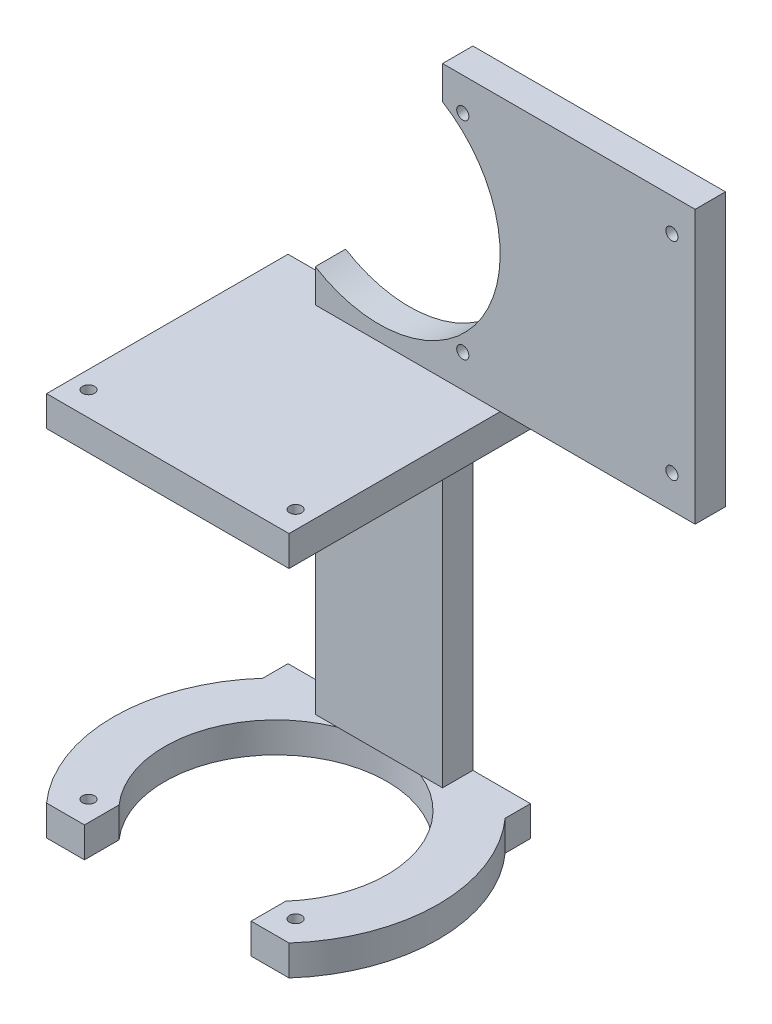
ISO-10303-21;
HEADER;
FILE_DESCRIPTION(('STEP AP214'),'2;1');
FILE_NAME('part.step','',(''),(''),'','','');
FILE_SCHEMA(('AUTOMOTIVE_DESIGN { 1 0 10303 214 1 1 1 1 }'));
ENDSEC;
DATA;
#1=APPLICATION_CONTEXT('core data for automotive mechanical design processes');
#2=APPLICATION_PROTOCOL_DEFINITION('international standard','automotive_design',2000,#1);
#3=PRODUCT_CONTEXT('',#1,'mechanical');
#4=PRODUCT('Part','Part','',(#3));
#5=PRODUCT_RELATED_PRODUCT_CATEGORY('part','',(#4));
#6=PRODUCT_DEFINITION_FORMATION('','',#4);
#7=PRODUCT_DEFINITION_CONTEXT('part definition',#1,'design');
#8=PRODUCT_DEFINITION('design','',#6,#7);
#9=PRODUCT_DEFINITION_SHAPE('','',#8);
#10=(LENGTH_UNIT() NAMED_UNIT(*) SI_UNIT(.MILLI.,.METRE.));
#11=(NAMED_UNIT(*) PLANE_ANGLE_UNIT() SI_UNIT($,.RADIAN.));
#12=(NAMED_UNIT(*) SI_UNIT($,.STERADIAN.) SOLID_ANGLE_UNIT());
#13=UNCERTAINTY_MEASURE_WITH_UNIT(LENGTH_MEASURE(1.E-05),#10,'distance_accuracy_value','');
#14=(GEOMETRIC_REPRESENTATION_CONTEXT(3) GLOBAL_UNCERTAINTY_ASSIGNED_CONTEXT((#13)) GLOBAL_UNIT_ASSIGNED_CONTEXT((#10,
#11,#12)) REPRESENTATION_CONTEXT('',''));
#15=CARTESIAN_POINT('',(0.,0.,0.));
#16=DIRECTION('',(0.,0.,1.));
#17=DIRECTION('',(1.,0.,0.));
#18=AXIS2_PLACEMENT_3D('',#15,#16,#17);
#19=CARTESIAN_POINT('',(0.,-38.1,0.));
#20=DIRECTION('',(0.,-1.,0.));
#21=DIRECTION('',(0.,0.,-1.));
#22=AXIS2_PLACEMENT_3D('',#19,#20,#21);
#23=PLANE('',#22);
#24=CARTESIAN_POINT('',(3.95000000000001,-38.1,21.5));
#25=DIRECTION('',(0.,-1.,0.));
#26=DIRECTION('',(0.,0.,-1.));
#27=AXIS2_PLACEMENT_3D('',#24,#25,#26);
#28=CIRCLE('',#27,0.6);
#29=CARTESIAN_POINT('',(3.95000000000001,-38.1,20.9));
#30=VERTEX_POINT('',#29);
#31=EDGE_CURVE('E228',#30,#30,#28,.T.);
#32=ORIENTED_EDGE('',*,*,#31,.F.);
#33=EDGE_LOOP('',(#32));
#34=FACE_BOUND('',#33,.T.);
#35=CARTESIAN_POINT('',(-16.55,-38.1,21.5));
#36=DIRECTION('',(0.,-1.,0.));
#37=DIRECTION('',(0.,0.,-1.));
#38=AXIS2_PLACEMENT_3D('',#35,#36,#37);
#39=CIRCLE('',#38,0.6);
#40=CARTESIAN_POINT('',(-16.55,-38.1,20.9));
#41=VERTEX_POINT('',#40);
#42=EDGE_CURVE('E276',#41,#41,#39,.T.);
#43=ORIENTED_EDGE('',*,*,#42,.F.);
#44=EDGE_LOOP('',(#43));
#45=FACE_BOUND('',#44,.T.);
#46=DIRECTION('',(1.,0.,0.));
#47=VECTOR('',#46,1.);
#48=CARTESIAN_POINT('',(-18.3,-38.1,23.9));
#49=LINE('',#48,#47);
#50=CARTESIAN_POINT('',(1.95,-38.1,23.9));
#51=VERTEX_POINT('',#50);
#52=CARTESIAN_POINT('',(5.70000000000001,-38.1,23.9));
#53=VERTEX_POINT('',#52);
#54=EDGE_CURVE('E213',#51,#53,#49,.T.);
#55=ORIENTED_EDGE('',*,*,#54,.F.);
#56=DIRECTION('',(0.,0.,-1.));
#57=VECTOR('',#56,1.);
#58=CARTESIAN_POINT('',(1.94999999999999,-38.1,0.));
#59=LINE('',#58,#57);
#60=CARTESIAN_POINT('',(1.95,-38.1,20.4758161054276));
#61=VERTEX_POINT('',#60);
#62=EDGE_CURVE('E256',#51,#61,#59,.T.);
#63=ORIENTED_EDGE('',*,*,#62,.T.);
#64=CARTESIAN_POINT('',(-6.29999999999999,-38.1,13.2));
#65=DIRECTION('',(0.,-1.,0.));
#66=DIRECTION('',(0.,0.,-1.));
#67=AXIS2_PLACEMENT_3D('',#64,#65,#66);
#68=CIRCLE('',#67,11.);
#69=CARTESIAN_POINT('',(-14.55,-38.1,20.4758161054276));
#70=VERTEX_POINT('',#69);
#71=EDGE_CURVE('E245',#70,#61,#68,.T.);
#72=ORIENTED_EDGE('',*,*,#71,.F.);
#73=DIRECTION('',(0.,0.,-1.));
#74=VECTOR('',#73,1.);
#75=CARTESIAN_POINT('',(-14.55,-38.1,0.));
#76=LINE('',#75,#74);
#77=CARTESIAN_POINT('',(-14.55,-38.1,23.9));
#78=VERTEX_POINT('',#77);
#79=EDGE_CURVE('E259',#78,#70,#76,.T.);
#80=ORIENTED_EDGE('',*,*,#79,.F.);
#81=CARTESIAN_POINT('',(-18.3,-38.1,23.9));
#82=VERTEX_POINT('',#81);
#83=EDGE_CURVE('E219',#82,#78,#49,.T.);
#84=ORIENTED_EDGE('',*,*,#83,.F.);
#85=CARTESIAN_POINT('',(-6.29999999999999,-38.1,13.2));
#86=DIRECTION('',(0.,-1.,0.));
#87=DIRECTION('',(0.,0.,-1.));
#88=AXIS2_PLACEMENT_3D('',#85,#86,#87);
#89=CIRCLE('',#88,16.0776242025991);
#90=CARTESIAN_POINT('',(-18.3,-38.1,2.5));
#91=VERTEX_POINT('',#90);
#92=EDGE_CURVE('E231',#82,#91,#89,.T.);
#93=ORIENTED_EDGE('',*,*,#92,.T.);
#94=DIRECTION('',(0.,0.,1.));
#95=VECTOR('',#94,1.);
#96=CARTESIAN_POINT('',(-18.3,-38.1,-24.1867732448957));
#97=LINE('',#96,#95);
#98=CARTESIAN_POINT('',(-18.3,-38.1,0.));
#99=VERTEX_POINT('',#98);
#100=EDGE_CURVE('E299',#99,#91,#97,.T.);
#101=ORIENTED_EDGE('',*,*,#100,.F.);
#102=DIRECTION('',(1.,0.,0.));
#103=VECTOR('',#102,1.);
#104=CARTESIAN_POINT('',(0.,-38.1,0.));
#105=LINE('',#104,#103);
#106=CARTESIAN_POINT('',(5.70000000000001,-38.1,0.));
#107=VERTEX_POINT('',#106);
#108=EDGE_CURVE('E361',#99,#107,#105,.T.);
#109=ORIENTED_EDGE('',*,*,#108,.T.);
#110=DIRECTION('',(0.,0.,1.));
#111=VECTOR('',#110,1.);
#112=CARTESIAN_POINT('',(5.70000000000001,-38.1,-24.1867732448957));
#113=LINE('',#112,#111);
#114=CARTESIAN_POINT('',(5.70000000000001,-38.1,2.5));
#115=VERTEX_POINT('',#114);
#116=EDGE_CURVE('E301',#107,#115,#113,.T.);
#117=ORIENTED_EDGE('',*,*,#116,.T.);
#118=CARTESIAN_POINT('',(-6.29999999999999,-38.1,13.2));
#119=DIRECTION('',(0.,-1.,0.));
#120=DIRECTION('',(0.,0.,-1.));
#121=AXIS2_PLACEMENT_3D('',#118,#119,#120);
#122=CIRCLE('',#121,16.0776242025991);
#123=EDGE_CURVE('E236',#115,#53,#122,.T.);
#124=ORIENTED_EDGE('',*,*,#123,.T.);
#125=EDGE_LOOP('',(#55,#63,#72,#80,#84,#93,#101,#109,#117,#124));
#126=FACE_BOUND('',#125,.T.);
#127=ADVANCED_FACE('F36',(#34,#45,#126),#23,.T.);
#128=CARTESIAN_POINT('',(-18.3,-35.1,-24.1867732448957));
#129=DIRECTION('',(0.,-1.,0.));
#130=DIRECTION('',(0.,0.,-1.));
#131=AXIS2_PLACEMENT_3D('',#128,#129,#130);
#132=PLANE('',#131);
#133=CARTESIAN_POINT('',(3.95000000000001,-35.1,21.5));
#134=DIRECTION('',(0.,-1.,0.));
#135=DIRECTION('',(0.,0.,-1.));
#136=AXIS2_PLACEMENT_3D('',#133,#134,#135);
#137=CIRCLE('',#136,0.6);
#138=CARTESIAN_POINT('',(3.95000000000001,-35.1,20.9));
#139=VERTEX_POINT('',#138);
#140=EDGE_CURVE('E273',#139,#139,#137,.T.);
#141=ORIENTED_EDGE('',*,*,#140,.T.);
#142=EDGE_LOOP('',(#141));
#143=FACE_BOUND('',#142,.T.);
#144=DIRECTION('',(0.,0.,1.));
#145=VECTOR('',#144,1.);
#146=CARTESIAN_POINT('',(1.94999999999999,-35.1,0.));
#147=LINE('',#146,#145);
#148=CARTESIAN_POINT('',(1.95,-35.1,20.4758161054276));
#149=VERTEX_POINT('',#148);
#150=CARTESIAN_POINT('',(1.95,-35.1,23.9));
#151=VERTEX_POINT('',#150);
#152=EDGE_CURVE('E226',#149,#151,#147,.T.);
#153=ORIENTED_EDGE('',*,*,#152,.T.);
#154=DIRECTION('',(1.,0.,0.));
#155=VECTOR('',#154,1.);
#156=CARTESIAN_POINT('',(-18.3,-35.1,23.9));
#157=LINE('',#156,#155);
#158=CARTESIAN_POINT('',(5.70000000000001,-35.1,23.9));
#159=VERTEX_POINT('',#158);
#160=EDGE_CURVE('E211',#151,#159,#157,.T.);
#161=ORIENTED_EDGE('',*,*,#160,.T.);
#162=CARTESIAN_POINT('',(-6.29999999999999,-35.1,13.2));
#163=DIRECTION('',(0.,-1.,0.));
#164=DIRECTION('',(0.,0.,-1.));
#165=AXIS2_PLACEMENT_3D('',#162,#163,#164);
#166=CIRCLE('',#165,16.0776242025991);
#167=CARTESIAN_POINT('',(5.70000000000001,-35.1,2.5));
#168=VERTEX_POINT('',#167);
#169=EDGE_CURVE('E224',#159,#168,#166,.F.);
#170=ORIENTED_EDGE('',*,*,#169,.T.);
#171=DIRECTION('',(0.,0.,1.));
#172=VECTOR('',#171,1.);
#173=CARTESIAN_POINT('',(5.70000000000001,-35.1,-24.1867732448957));
#174=LINE('',#173,#172);
#175=CARTESIAN_POINT('',(5.70000000000001,-35.1,0.));
#176=VERTEX_POINT('',#175);
#177=EDGE_CURVE('E51',#176,#168,#174,.T.);
#178=ORIENTED_EDGE('',*,*,#177,.F.);
#179=DIRECTION('',(1.,0.,0.));
#180=VECTOR('',#179,1.);
#181=CARTESIAN_POINT('',(-18.3,-35.1,0.));
#182=LINE('',#181,#180);
#183=CARTESIAN_POINT('',(0.,-35.1,0.));
#184=VERTEX_POINT('',#183);
#185=EDGE_CURVE('E295',#184,#176,#182,.T.);
#186=ORIENTED_EDGE('',*,*,#185,.F.);
#187=DIRECTION('',(0.,0.,1.));
#188=VECTOR('',#187,1.);
#189=CARTESIAN_POINT('',(0.,-35.1,0.));
#190=LINE('',#189,#188);
#191=CARTESIAN_POINT('',(0.,-35.1,3.));
#192=VERTEX_POINT('',#191);
#193=EDGE_CURVE('E309',#184,#192,#190,.T.);
#194=ORIENTED_EDGE('',*,*,#193,.T.);
#195=DIRECTION('',(-1.,0.,0.));
#196=VECTOR('',#195,1.);
#197=CARTESIAN_POINT('',(0.,-35.1,3.));
#198=LINE('',#197,#196);
#199=CARTESIAN_POINT('',(-2.18174794360519,-35.1,3.));
#200=VERTEX_POINT('',#199);
#201=EDGE_CURVE('E306',#192,#200,#198,.T.);
#202=ORIENTED_EDGE('',*,*,#201,.T.);
#203=CARTESIAN_POINT('',(-6.29999999999999,-35.1,13.2));
#204=DIRECTION('',(0.,-1.,0.));
#205=DIRECTION('',(0.,0.,-1.));
#206=AXIS2_PLACEMENT_3D('',#203,#204,#205);
#207=CIRCLE('',#206,11.);
#208=EDGE_CURVE('E249',#149,#200,#207,.F.);
#209=ORIENTED_EDGE('',*,*,#208,.F.);
#210=EDGE_LOOP('',(#153,#161,#170,#178,#186,#194,#202,#209));
#211=FACE_BOUND('',#210,.T.);
#212=ADVANCED_FACE('F223',(#143,#211),#132,.F.);
#213=CARTESIAN_POINT('',(0.,-38.1,23.9));
#214=DIRECTION('',(0.,0.,-1.));
#215=DIRECTION('',(-1.,0.,0.));
#216=AXIS2_PLACEMENT_3D('',#213,#214,#215);
#217=PLANE('',#216);
#218=DIRECTION('',(0.,-1.,0.));
#219=VECTOR('',#218,1.);
#220=CARTESIAN_POINT('',(1.95,-4.1987055287323,23.9));
#221=LINE('',#220,#219);
#222=EDGE_CURVE('E267',#151,#51,#221,.T.);
#223=ORIENTED_EDGE('',*,*,#222,.T.);
#224=ORIENTED_EDGE('',*,*,#54,.T.);
#225=DIRECTION('',(0.,1.,0.));
#226=VECTOR('',#225,1.);
#227=CARTESIAN_POINT('',(5.70000000000001,-38.1,23.9));
#228=LINE('',#227,#226);
#229=EDGE_CURVE('E207',#53,#159,#228,.T.);
#230=ORIENTED_EDGE('',*,*,#229,.T.);
#231=ORIENTED_EDGE('',*,*,#160,.F.);
#232=EDGE_LOOP('',(#223,#224,#230,#231));
#233=FACE_BOUND('',#232,.T.);
#234=ADVANCED_FACE('F210',(#233),#217,.F.);
#235=CARTESIAN_POINT('',(0.,0.,3.));
#236=DIRECTION('',(0.,0.,-1.));
#237=DIRECTION('',(-1.,0.,0.));
#238=AXIS2_PLACEMENT_3D('',#235,#236,#237);
#239=PLANE('',#238);
#240=ORIENTED_EDGE('',*,*,#201,.F.);
#241=DIRECTION('',(0.,-1.,0.));
#242=VECTOR('',#241,1.);
#243=CARTESIAN_POINT('',(0.,0.,3.));
#244=LINE('',#243,#242);
#245=CARTESIAN_POINT('',(0.,-3.,3.));
#246=VERTEX_POINT('',#245);
#247=EDGE_CURVE('E371',#246,#192,#244,.T.);
#248=ORIENTED_EDGE('',*,*,#247,.F.);
#249=DIRECTION('',(-1.,0.,0.));
#250=VECTOR('',#249,1.);
#251=CARTESIAN_POINT('',(0.,-3.,3.));
#252=LINE('',#251,#250);
#253=CARTESIAN_POINT('',(-12.6,-3.,3.));
#254=VERTEX_POINT('',#253);
#255=EDGE_CURVE('E347',#246,#254,#252,.T.);
#256=ORIENTED_EDGE('',*,*,#255,.T.);
#257=DIRECTION('',(0.,-1.,0.));
#258=VECTOR('',#257,1.);
#259=CARTESIAN_POINT('',(-12.6,0.,3.));
#260=LINE('',#259,#258);
#261=CARTESIAN_POINT('',(-12.6,-35.1,3.));
#262=VERTEX_POINT('',#261);
#263=EDGE_CURVE('E358',#254,#262,#260,.T.);
#264=ORIENTED_EDGE('',*,*,#263,.T.);
#265=CARTESIAN_POINT('',(-10.4182520563948,-35.1,3.));
#266=VERTEX_POINT('',#265);
#267=EDGE_CURVE('E294',#266,#262,#198,.T.);
#268=ORIENTED_EDGE('',*,*,#267,.F.);
#269=DIRECTION('',(-1.,0.,0.));
#270=VECTOR('',#269,1.);
#271=CARTESIAN_POINT('',(0.,-35.1,3.));
#272=LINE('',#271,#270);
#273=EDGE_CURVE('E252',#200,#266,#272,.T.);
#274=ORIENTED_EDGE('',*,*,#273,.F.);
#275=EDGE_LOOP('',(#240,#248,#256,#264,#268,#274));
#276=FACE_BOUND('',#275,.T.);
#277=ADVANCED_FACE('F550',(#276),#239,.F.);
#278=CARTESIAN_POINT('',(0.,0.,0.));
#279=DIRECTION('',(-1.,0.,0.));
#280=DIRECTION('',(0.,-1.,0.));
#281=AXIS2_PLACEMENT_3D('',#278,#279,#280);
#282=PLANE('',#281);
#283=ORIENTED_EDGE('',*,*,#193,.F.);
#284=DIRECTION('',(0.,-1.,0.));
#285=VECTOR('',#284,1.);
#286=CARTESIAN_POINT('',(0.,0.,0.));
#287=LINE('',#286,#285);
#288=CARTESIAN_POINT('',(0.,-3.,0.));
#289=VERTEX_POINT('',#288);
#290=EDGE_CURVE('E364',#289,#184,#287,.T.);
#291=ORIENTED_EDGE('',*,*,#290,.F.);
#292=DIRECTION('',(0.,0.,1.));
#293=VECTOR('',#292,1.);
#294=CARTESIAN_POINT('',(0.,-3.,0.));
#295=LINE('',#294,#293);
#296=EDGE_CURVE('E356',#289,#246,#295,.T.);
#297=ORIENTED_EDGE('',*,*,#296,.T.);
#298=ORIENTED_EDGE('',*,*,#247,.T.);
#299=EDGE_LOOP('',(#283,#291,#297,#298));
#300=FACE_BOUND('',#299,.T.);
#301=ADVANCED_FACE('F524',(#300),#282,.F.);
#302=CARTESIAN_POINT('',(-12.6,0.,0.));
#303=DIRECTION('',(-1.,0.,0.));
#304=DIRECTION('',(0.,-1.,0.));
#305=AXIS2_PLACEMENT_3D('',#302,#303,#304);
#306=PLANE('',#305);
#307=DIRECTION('',(0.,-1.,0.));
#308=VECTOR('',#307,1.);
#309=CARTESIAN_POINT('',(-12.6,0.,0.));
#310=LINE('',#309,#308);
#311=CARTESIAN_POINT('',(-12.6,-3.,0.));
#312=VERTEX_POINT('',#311);
#313=CARTESIAN_POINT('',(-12.6,-35.1,0.));
#314=VERTEX_POINT('',#313);
#315=EDGE_CURVE('E362',#312,#314,#310,.T.);
#316=ORIENTED_EDGE('',*,*,#315,.T.);
#317=DIRECTION('',(0.,0.,1.));
#318=VECTOR('',#317,1.);
#319=CARTESIAN_POINT('',(-12.6,-35.1,0.));
#320=LINE('',#319,#318);
#321=EDGE_CURVE('E11',#314,#262,#320,.T.);
#322=ORIENTED_EDGE('',*,*,#321,.T.);
#323=ORIENTED_EDGE('',*,*,#263,.F.);
#324=DIRECTION('',(0.,0.,1.));
#325=VECTOR('',#324,1.);
#326=CARTESIAN_POINT('',(-12.6,-3.,0.));
#327=LINE('',#326,#325);
#328=EDGE_CURVE('E44',#312,#254,#327,.T.);
#329=ORIENTED_EDGE('',*,*,#328,.F.);
#330=EDGE_LOOP('',(#316,#322,#323,#329));
#331=FACE_BOUND('',#330,.T.);
#332=ADVANCED_FACE('F526',(#331),#306,.T.);
#333=CARTESIAN_POINT('',(0.,0.,3.));
#334=DIRECTION('',(0.,1.,0.));
#335=DIRECTION('',(0.,0.,1.));
#336=AXIS2_PLACEMENT_3D('',#333,#334,#335);
#337=PLANE('',#336);
#338=DIRECTION('',(0.,0.,1.));
#339=VECTOR('',#338,1.);
#340=CARTESIAN_POINT('',(5.70000000000001,0.,-24.1867732448957));
#341=LINE('',#340,#339);
#342=CARTESIAN_POINT('',(5.70000000000001,0.,0.));
#343=VERTEX_POINT('',#342);
#344=CARTESIAN_POINT('',(5.70000000000001,0.,3.));
#345=VERTEX_POINT('',#344);
#346=EDGE_CURVE('E337',#343,#345,#341,.T.);
#347=ORIENTED_EDGE('',*,*,#346,.F.);
#348=DIRECTION('',(1.,0.,0.));
#349=VECTOR('',#348,1.);
#350=CARTESIAN_POINT('',(0.,0.,0.));
#351=LINE('',#350,#349);
#352=CARTESIAN_POINT('',(25.,0.,0.));
#353=VERTEX_POINT('',#352);
#354=EDGE_CURVE('E423',#343,#353,#351,.T.);
#355=ORIENTED_EDGE('',*,*,#354,.T.);
#356=DIRECTION('',(0.,0.,-1.));
#357=VECTOR('',#356,1.);
#358=CARTESIAN_POINT('',(25.,0.,3.));
#359=LINE('',#358,#357);
#360=CARTESIAN_POINT('',(25.,0.,3.));
#361=VERTEX_POINT('',#360);
#362=EDGE_CURVE('E433',#361,#353,#359,.T.);
#363=ORIENTED_EDGE('',*,*,#362,.F.);
#364=DIRECTION('',(1.,0.,0.));
#365=VECTOR('',#364,1.);
#366=CARTESIAN_POINT('',(0.,0.,3.));
#367=LINE('',#366,#365);
#368=EDGE_CURVE('E411',#345,#361,#367,.T.);
#369=ORIENTED_EDGE('',*,*,#368,.F.);
#370=EDGE_LOOP('',(#347,#355,#363,#369));
#371=FACE_BOUND('',#370,.T.);
#372=ADVANCED_FACE('F465',(#371),#337,.F.);
#373=CARTESIAN_POINT('',(2.,23.75,3.));
#374=DIRECTION('',(0.,0.,-1.));
#375=DIRECTION('',(-1.,0.,0.));
#376=AXIS2_PLACEMENT_3D('',#373,#374,#375);
#377=CIRCLE('',#376,0.6);
#378=CARTESIAN_POINT('',(1.4,23.75,3.));
#379=VERTEX_POINT('',#378);
#380=EDGE_CURVE('E393',#379,#379,#377,.F.);
#381=ORIENTED_EDGE('',*,*,#380,.F.);
#382=EDGE_LOOP('',(#381));
#383=FACE_BOUND('',#382,.T.);
#384=CARTESIAN_POINT('',(22.7,23.75,3.));
#385=DIRECTION('',(0.,0.,-1.));
#386=DIRECTION('',(-1.,0.,0.));
#387=AXIS2_PLACEMENT_3D('',#384,#385,#386);
#388=CIRCLE('',#387,0.6);
#389=CARTESIAN_POINT('',(22.1,23.75,3.));
#390=VERTEX_POINT('',#389);
#391=EDGE_CURVE('E396',#390,#390,#388,.F.);
#392=ORIENTED_EDGE('',*,*,#391,.F.);
#393=EDGE_LOOP('',(#392));
#394=FACE_BOUND('',#393,.T.);
#395=CARTESIAN_POINT('',(22.7,3.25,3.));
#396=DIRECTION('',(0.,0.,-1.));
#397=DIRECTION('',(-1.,0.,0.));
#398=AXIS2_PLACEMENT_3D('',#395,#396,#397);
#399=CIRCLE('',#398,0.6);
#400=CARTESIAN_POINT('',(22.1,3.25,3.));
#401=VERTEX_POINT('',#400);
#402=EDGE_CURVE('E399',#401,#401,#399,.F.);
#403=ORIENTED_EDGE('',*,*,#402,.F.);
#404=EDGE_LOOP('',(#403));
#405=FACE_BOUND('',#404,.T.);
#406=CARTESIAN_POINT('',(2.,3.25,3.));
#407=DIRECTION('',(0.,0.,-1.));
#408=DIRECTION('',(-1.,0.,0.));
#409=AXIS2_PLACEMENT_3D('',#406,#407,#408);
#410=CIRCLE('',#409,0.6);
#411=CARTESIAN_POINT('',(1.4,3.25,3.));
#412=VERTEX_POINT('',#411);
#413=EDGE_CURVE('E404',#412,#412,#410,.F.);
#414=ORIENTED_EDGE('',*,*,#413,.F.);
#415=EDGE_LOOP('',(#414));
#416=FACE_BOUND('',#415,.T.);
#417=CARTESIAN_POINT('',(-12.6,3.28677328167047,3.));
#418=VERTEX_POINT('',#417);
#419=CARTESIAN_POINT('',(-12.6,0.,3.));
#420=VERTEX_POINT('',#419);
#421=EDGE_CURVE('E368',#418,#420,#260,.T.);
#422=ORIENTED_EDGE('',*,*,#421,.T.);
#423=EDGE_CURVE('E413',#420,#345,#367,.T.);
#424=ORIENTED_EDGE('',*,*,#423,.T.);
#425=ORIENTED_EDGE('',*,*,#368,.T.);
#426=DIRECTION('',(0.,1.,0.));
#427=VECTOR('',#426,1.);
#428=CARTESIAN_POINT('',(25.,0.,3.));
#429=LINE('',#428,#427);
#430=CARTESIAN_POINT('',(25.,27.,3.));
#431=VERTEX_POINT('',#430);
#432=EDGE_CURVE('E416',#361,#431,#429,.T.);
#433=ORIENTED_EDGE('',*,*,#432,.T.);
#434=DIRECTION('',(-1.,0.,0.));
#435=VECTOR('',#434,1.);
#436=CARTESIAN_POINT('',(0.,27.,3.));
#437=LINE('',#436,#435);
#438=CARTESIAN_POINT('',(0.,27.,3.));
#439=VERTEX_POINT('',#438);
#440=EDGE_CURVE('E418',#431,#439,#437,.T.);
#441=ORIENTED_EDGE('',*,*,#440,.T.);
#442=DIRECTION('',(0.,-1.,0.));
#443=VECTOR('',#442,1.);
#444=CARTESIAN_POINT('',(0.,0.,3.));
#445=LINE('',#444,#443);
#446=CARTESIAN_POINT('',(0.,23.7132267183295,3.));
#447=VERTEX_POINT('',#446);
#448=EDGE_CURVE('E408',#439,#447,#445,.T.);
#449=ORIENTED_EDGE('',*,*,#448,.T.);
#450=CARTESIAN_POINT('',(-6.3,13.5,3.));
#451=DIRECTION('',(0.,0.,-1.));
#452=DIRECTION('',(-1.,0.,0.));
#453=AXIS2_PLACEMENT_3D('',#450,#451,#452);
#454=CIRCLE('',#453,12.);
#455=EDGE_CURVE('E402',#418,#447,#454,.F.);
#456=ORIENTED_EDGE('',*,*,#455,.F.);
#457=EDGE_LOOP('',(#422,#424,#425,#433,#441,#449,#456));
#458=FACE_BOUND('',#457,.T.);
#459=ADVANCED_FACE('F484',(#383,#394,#405,#416,#458),#239,.F.);
#460=CARTESIAN_POINT('',(-12.6,3.28677328167047,0.));
#461=VERTEX_POINT('',#460);
#462=CARTESIAN_POINT('',(-12.6,0.,0.));
#463=VERTEX_POINT('',#462);
#464=EDGE_CURVE('E359',#461,#463,#310,.T.);
#465=ORIENTED_EDGE('',*,*,#464,.T.);
#466=DIRECTION('',(0.,0.,1.));
#467=VECTOR('',#466,1.);
#468=CARTESIAN_POINT('',(-12.6,0.,0.));
#469=LINE('',#468,#467);
#470=EDGE_CURVE('E436',#463,#420,#469,.T.);
#471=ORIENTED_EDGE('',*,*,#470,.T.);
#472=ORIENTED_EDGE('',*,*,#421,.F.);
#473=DIRECTION('',(0.,0.,1.));
#474=VECTOR('',#473,1.);
#475=CARTESIAN_POINT('',(-12.6,3.28677328167047,0.));
#476=LINE('',#475,#474);
#477=EDGE_CURVE('E367',#461,#418,#476,.T.);
#478=ORIENTED_EDGE('',*,*,#477,.F.);
#479=EDGE_LOOP('',(#465,#471,#472,#478));
#480=FACE_BOUND('',#479,.T.);
#481=ADVANCED_FACE('F488',(#480),#306,.T.);
#482=CARTESIAN_POINT('',(0.,0.,3.));
#483=DIRECTION('',(1.,0.,0.));
#484=DIRECTION('',(0.,0.,-1.));
#485=AXIS2_PLACEMENT_3D('',#482,#483,#484);
#486=PLANE('',#485);
#487=DIRECTION('',(0.,0.,1.));
#488=VECTOR('',#487,1.);
#489=CARTESIAN_POINT('',(0.,23.7132267183295,-0.00100000000000013));
#490=LINE('',#489,#488);
#491=CARTESIAN_POINT('',(0.,23.7132267183295,0.));
#492=VERTEX_POINT('',#491);
#493=EDGE_CURVE('E376',#447,#492,#490,.F.);
#494=ORIENTED_EDGE('',*,*,#493,.F.);
#495=ORIENTED_EDGE('',*,*,#448,.F.);
#496=DIRECTION('',(0.,0.,-1.));
#497=VECTOR('',#496,1.);
#498=CARTESIAN_POINT('',(0.,27.,3.));
#499=LINE('',#498,#497);
#500=CARTESIAN_POINT('',(0.,27.,0.));
#501=VERTEX_POINT('',#500);
#502=EDGE_CURVE('E420',#439,#501,#499,.T.);
#503=ORIENTED_EDGE('',*,*,#502,.T.);
#504=DIRECTION('',(0.,-1.,0.));
#505=VECTOR('',#504,1.);
#506=CARTESIAN_POINT('',(0.,0.,0.));
#507=LINE('',#506,#505);
#508=EDGE_CURVE('E407',#501,#492,#507,.T.);
#509=ORIENTED_EDGE('',*,*,#508,.T.);
#510=EDGE_LOOP('',(#494,#495,#503,#509));
#511=FACE_BOUND('',#510,.T.);
#512=ADVANCED_FACE('F38',(#511),#486,.F.);
#513=CARTESIAN_POINT('',(25.,0.,3.));
#514=DIRECTION('',(-1.,0.,0.));
#515=DIRECTION('',(0.,0.,1.));
#516=AXIS2_PLACEMENT_3D('',#513,#514,#515);
#517=PLANE('',#516);
#518=DIRECTION('',(0.,1.,0.));
#519=VECTOR('',#518,1.);
#520=CARTESIAN_POINT('',(25.,0.,0.));
#521=LINE('',#520,#519);
#522=CARTESIAN_POINT('',(25.,27.,0.));
#523=VERTEX_POINT('',#522);
#524=EDGE_CURVE('E425',#353,#523,#521,.T.);
#525=ORIENTED_EDGE('',*,*,#524,.T.);
#526=DIRECTION('',(0.,0.,-1.));
#527=VECTOR('',#526,1.);
#528=CARTESIAN_POINT('',(25.,27.,3.));
#529=LINE('',#528,#527);
#530=EDGE_CURVE('E430',#431,#523,#529,.T.);
#531=ORIENTED_EDGE('',*,*,#530,.F.);
#532=ORIENTED_EDGE('',*,*,#432,.F.);
#533=ORIENTED_EDGE('',*,*,#362,.T.);
#534=EDGE_LOOP('',(#525,#531,#532,#533));
#535=FACE_BOUND('',#534,.T.);
#536=ADVANCED_FACE('F476',(#535),#517,.F.);
#537=CARTESIAN_POINT('',(0.,27.,3.));
#538=DIRECTION('',(0.,-1.,0.));
#539=DIRECTION('',(0.,0.,-1.));
#540=AXIS2_PLACEMENT_3D('',#537,#538,#539);
#541=PLANE('',#540);
#542=DIRECTION('',(-1.,0.,0.));
#543=VECTOR('',#542,1.);
#544=CARTESIAN_POINT('',(0.,27.,0.));
#545=LINE('',#544,#543);
#546=EDGE_CURVE('E412',#523,#501,#545,.T.);
#547=ORIENTED_EDGE('',*,*,#546,.T.);
#548=ORIENTED_EDGE('',*,*,#502,.F.);
#549=ORIENTED_EDGE('',*,*,#440,.F.);
#550=ORIENTED_EDGE('',*,*,#530,.T.);
#551=EDGE_LOOP('',(#547,#548,#549,#550));
#552=FACE_BOUND('',#551,.T.);
#553=ADVANCED_FACE('F480',(#552),#541,.F.);
#554=CARTESIAN_POINT('',(0.,0.,0.));
#555=DIRECTION('',(0.,0.,-1.));
#556=DIRECTION('',(-1.,0.,0.));
#557=AXIS2_PLACEMENT_3D('',#554,#555,#556);
#558=PLANE('',#557);
#559=CARTESIAN_POINT('',(-18.3,-35.1,0.));
#560=VERTEX_POINT('',#559);
#561=EDGE_CURVE('E291',#560,#314,#182,.T.);
#562=ORIENTED_EDGE('',*,*,#561,.T.);
#563=ORIENTED_EDGE('',*,*,#315,.F.);
#564=DIRECTION('',(1.,0.,0.));
#565=VECTOR('',#564,1.);
#566=CARTESIAN_POINT('',(-18.3,-3.,0.));
#567=LINE('',#566,#565);
#568=CARTESIAN_POINT('',(-18.3,-3.,0.));
#569=VERTEX_POINT('',#568);
#570=EDGE_CURVE('E342',#569,#312,#567,.T.);
#571=ORIENTED_EDGE('',*,*,#570,.F.);
#572=DIRECTION('',(0.,-1.,0.));
#573=VECTOR('',#572,1.);
#574=CARTESIAN_POINT('',(-18.3,0.,0.));
#575=LINE('',#574,#573);
#576=CARTESIAN_POINT('',(-18.3,0.,0.));
#577=VERTEX_POINT('',#576);
#578=EDGE_CURVE('E338',#577,#569,#575,.T.);
#579=ORIENTED_EDGE('',*,*,#578,.F.);
#580=DIRECTION('',(1.,0.,0.));
#581=VECTOR('',#580,1.);
#582=CARTESIAN_POINT('',(-18.3,0.,0.));
#583=LINE('',#582,#581);
#584=EDGE_CURVE('E333',#577,#463,#583,.T.);
#585=ORIENTED_EDGE('',*,*,#584,.T.);
#586=ORIENTED_EDGE('',*,*,#464,.F.);
#587=CARTESIAN_POINT('',(-6.3,13.5,0.));
#588=DIRECTION('',(0.,0.,-1.));
#589=DIRECTION('',(-1.,0.,0.));
#590=AXIS2_PLACEMENT_3D('',#587,#588,#589);
#591=CIRCLE('',#590,12.);
#592=EDGE_CURVE('E386',#461,#492,#591,.F.);
#593=ORIENTED_EDGE('',*,*,#592,.T.);
#594=ORIENTED_EDGE('',*,*,#508,.F.);
#595=ORIENTED_EDGE('',*,*,#546,.F.);
#596=ORIENTED_EDGE('',*,*,#524,.F.);
#597=ORIENTED_EDGE('',*,*,#354,.F.);
#598=DIRECTION('',(0.,-1.,0.));
#599=VECTOR('',#598,1.);
#600=CARTESIAN_POINT('',(5.70000000000001,0.,0.));
#601=LINE('',#600,#599);
#602=CARTESIAN_POINT('',(5.70000000000001,-3.,0.));
#603=VERTEX_POINT('',#602);
#604=EDGE_CURVE('E336',#343,#603,#601,.T.);
#605=ORIENTED_EDGE('',*,*,#604,.T.);
#606=EDGE_CURVE('E332',#289,#603,#567,.T.);
#607=ORIENTED_EDGE('',*,*,#606,.F.);
#608=ORIENTED_EDGE('',*,*,#290,.T.);
#609=ORIENTED_EDGE('',*,*,#185,.T.);
#610=DIRECTION('',(0.,1.,0.));
#611=VECTOR('',#610,1.);
#612=CARTESIAN_POINT('',(5.70000000000001,-38.1,0.));
#613=LINE('',#612,#611);
#614=EDGE_CURVE('E289',#107,#176,#613,.T.);
#615=ORIENTED_EDGE('',*,*,#614,.F.);
#616=ORIENTED_EDGE('',*,*,#108,.F.);
#617=DIRECTION('',(0.,1.,0.));
#618=VECTOR('',#617,1.);
#619=CARTESIAN_POINT('',(-18.3,-38.1,0.));
#620=LINE('',#619,#618);
#621=EDGE_CURVE('E296',#99,#560,#620,.T.);
#622=ORIENTED_EDGE('',*,*,#621,.T.);
#623=EDGE_LOOP('',(#562,#563,#571,#579,#585,#586,#593,#594,#595,#596,#597,#605,#607,#608,#609,
#615,#616,#622));
#624=FACE_BOUND('',#623,.T.);
#625=CARTESIAN_POINT('',(2.,3.25,0.));
#626=DIRECTION('',(0.,0.,-1.));
#627=DIRECTION('',(-1.,0.,0.));
#628=AXIS2_PLACEMENT_3D('',#625,#626,#627);
#629=CIRCLE('',#628,0.6);
#630=CARTESIAN_POINT('',(1.4,3.25,0.));
#631=VERTEX_POINT('',#630);
#632=EDGE_CURVE('E384',#631,#631,#629,.F.);
#633=ORIENTED_EDGE('',*,*,#632,.T.);
#634=EDGE_LOOP('',(#633));
#635=FACE_BOUND('',#634,.T.);
#636=CARTESIAN_POINT('',(22.7,3.25,0.));
#637=DIRECTION('',(0.,0.,-1.));
#638=DIRECTION('',(-1.,0.,0.));
#639=AXIS2_PLACEMENT_3D('',#636,#637,#638);
#640=CIRCLE('',#639,0.6);
#641=CARTESIAN_POINT('',(22.1,3.25,0.));
#642=VERTEX_POINT('',#641);
#643=EDGE_CURVE('E381',#642,#642,#640,.F.);
#644=ORIENTED_EDGE('',*,*,#643,.T.);
#645=EDGE_LOOP('',(#644));
#646=FACE_BOUND('',#645,.T.);
#647=CARTESIAN_POINT('',(22.7,23.75,0.));
#648=DIRECTION('',(0.,0.,-1.));
#649=DIRECTION('',(-1.,0.,0.));
#650=AXIS2_PLACEMENT_3D('',#647,#648,#649);
#651=CIRCLE('',#650,0.6);
#652=CARTESIAN_POINT('',(22.1,23.75,0.));
#653=VERTEX_POINT('',#652);
#654=EDGE_CURVE('E377',#653,#653,#651,.F.);
#655=ORIENTED_EDGE('',*,*,#654,.T.);
#656=EDGE_LOOP('',(#655));
#657=FACE_BOUND('',#656,.T.);
#658=CARTESIAN_POINT('',(2.,23.75,0.));
#659=DIRECTION('',(0.,0.,-1.));
#660=DIRECTION('',(-1.,0.,0.));
#661=AXIS2_PLACEMENT_3D('',#658,#659,#660);
#662=CIRCLE('',#661,0.6);
#663=CARTESIAN_POINT('',(1.4,23.75,0.));
#664=VERTEX_POINT('',#663);
#665=EDGE_CURVE('E380',#664,#664,#662,.F.);
#666=ORIENTED_EDGE('',*,*,#665,.T.);
#667=EDGE_LOOP('',(#666));
#668=FACE_BOUND('',#667,.T.);
#669=ADVANCED_FACE('F469',(#624,#635,#646,#657,#668),#558,.T.);
#670=CARTESIAN_POINT('',(2.,23.75,3.000012));
#671=DIRECTION('',(0.,0.,-1.));
#672=DIRECTION('',(-1.,0.,0.));
#673=AXIS2_PLACEMENT_3D('',#670,#671,#672);
#674=CYLINDRICAL_SURFACE('',#673,0.6);
#675=ORIENTED_EDGE('',*,*,#665,.F.);
#676=EDGE_LOOP('',(#675));
#677=FACE_BOUND('',#676,.T.);
#678=ORIENTED_EDGE('',*,*,#380,.T.);
#679=EDGE_LOOP('',(#678));
#680=FACE_BOUND('',#679,.T.);
#681=ADVANCED_FACE('F534',(#677,#680),#674,.F.);
#682=CARTESIAN_POINT('',(22.7,23.75,3.000012));
#683=DIRECTION('',(0.,0.,-1.));
#684=DIRECTION('',(-1.,0.,0.));
#685=AXIS2_PLACEMENT_3D('',#682,#683,#684);
#686=CYLINDRICAL_SURFACE('',#685,0.6);
#687=ORIENTED_EDGE('',*,*,#654,.F.);
#688=EDGE_LOOP('',(#687));
#689=FACE_BOUND('',#688,.T.);
#690=ORIENTED_EDGE('',*,*,#391,.T.);
#691=EDGE_LOOP('',(#690));
#692=FACE_BOUND('',#691,.T.);
#693=ADVANCED_FACE('F530',(#689,#692),#686,.F.);
#694=CARTESIAN_POINT('',(22.7,3.25,3.000012));
#695=DIRECTION('',(0.,0.,-1.));
#696=DIRECTION('',(-1.,0.,0.));
#697=AXIS2_PLACEMENT_3D('',#694,#695,#696);
#698=CYLINDRICAL_SURFACE('',#697,0.6);
#699=ORIENTED_EDGE('',*,*,#643,.F.);
#700=EDGE_LOOP('',(#699));
#701=FACE_BOUND('',#700,.T.);
#702=ORIENTED_EDGE('',*,*,#402,.T.);
#703=EDGE_LOOP('',(#702));
#704=FACE_BOUND('',#703,.T.);
#705=ADVANCED_FACE('F533',(#701,#704),#698,.F.);
#706=CARTESIAN_POINT('',(-6.3,13.5,3.000012));
#707=DIRECTION('',(0.,0.,-1.));
#708=DIRECTION('',(-1.,0.,0.));
#709=AXIS2_PLACEMENT_3D('',#706,#707,#708);
#710=CYLINDRICAL_SURFACE('',#709,12.);
#711=ORIENTED_EDGE('',*,*,#455,.T.);
#712=ORIENTED_EDGE('',*,*,#493,.T.);
#713=ORIENTED_EDGE('',*,*,#592,.F.);
#714=ORIENTED_EDGE('',*,*,#477,.T.);
#715=EDGE_LOOP('',(#711,#712,#713,#714));
#716=FACE_BOUND('',#715,.T.);
#717=ADVANCED_FACE('F538',(#716),#710,.F.);
#718=CARTESIAN_POINT('',(2.,3.25,3.000012));
#719=DIRECTION('',(0.,0.,-1.));
#720=DIRECTION('',(-1.,0.,0.));
#721=AXIS2_PLACEMENT_3D('',#718,#719,#720);
#722=CYLINDRICAL_SURFACE('',#721,0.6);
#723=ORIENTED_EDGE('',*,*,#632,.F.);
#724=EDGE_LOOP('',(#723));
#725=FACE_BOUND('',#724,.T.);
#726=ORIENTED_EDGE('',*,*,#413,.T.);
#727=EDGE_LOOP('',(#726));
#728=FACE_BOUND('',#727,.T.);
#729=ADVANCED_FACE('F542',(#725,#728),#722,.F.);
#730=CARTESIAN_POINT('',(-18.3,-3.,-24.1867732448957));
#731=DIRECTION('',(0.,-1.,0.));
#732=DIRECTION('',(0.,0.,-1.));
#733=AXIS2_PLACEMENT_3D('',#730,#731,#732);
#734=PLANE('',#733);
#735=CARTESIAN_POINT('',(3.95000000000001,-3.,21.5));
#736=DIRECTION('',(0.,-1.,0.));
#737=DIRECTION('',(0.,0.,-1.));
#738=AXIS2_PLACEMENT_3D('',#735,#736,#737);
#739=CIRCLE('',#738,0.6);
#740=CARTESIAN_POINT('',(3.95000000000001,-3.,20.9));
#741=VERTEX_POINT('',#740);
#742=EDGE_CURVE('E313',#741,#741,#739,.F.);
#743=ORIENTED_EDGE('',*,*,#742,.T.);
#744=EDGE_LOOP('',(#743));
#745=FACE_BOUND('',#744,.T.);
#746=CARTESIAN_POINT('',(-16.55,-3.,21.5));
#747=DIRECTION('',(0.,-1.,0.));
#748=DIRECTION('',(0.,0.,-1.));
#749=AXIS2_PLACEMENT_3D('',#746,#747,#748);
#750=CIRCLE('',#749,0.6);
#751=CARTESIAN_POINT('',(-16.55,-3.,20.9));
#752=VERTEX_POINT('',#751);
#753=EDGE_CURVE('E312',#752,#752,#750,.F.);
#754=ORIENTED_EDGE('',*,*,#753,.T.);
#755=EDGE_LOOP('',(#754));
#756=FACE_BOUND('',#755,.T.);
#757=ORIENTED_EDGE('',*,*,#296,.F.);
#758=ORIENTED_EDGE('',*,*,#606,.T.);
#759=DIRECTION('',(0.,0.,1.));
#760=VECTOR('',#759,1.);
#761=CARTESIAN_POINT('',(5.70000000000001,-3.,-24.1867732448957));
#762=LINE('',#761,#760);
#763=CARTESIAN_POINT('',(5.70000000000001,-3.,23.9));
#764=VERTEX_POINT('',#763);
#765=EDGE_CURVE('E341',#603,#764,#762,.T.);
#766=ORIENTED_EDGE('',*,*,#765,.T.);
#767=DIRECTION('',(1.,0.,0.));
#768=VECTOR('',#767,1.);
#769=CARTESIAN_POINT('',(-18.3,-3.,23.9));
#770=LINE('',#769,#768);
#771=CARTESIAN_POINT('',(-18.3,-3.,23.9));
#772=VERTEX_POINT('',#771);
#773=EDGE_CURVE('E319',#772,#764,#770,.T.);
#774=ORIENTED_EDGE('',*,*,#773,.F.);
#775=DIRECTION('',(0.,0.,1.));
#776=VECTOR('',#775,1.);
#777=CARTESIAN_POINT('',(-18.3,-3.,-24.1867732448957));
#778=LINE('',#777,#776);
#779=EDGE_CURVE('E340',#569,#772,#778,.T.);
#780=ORIENTED_EDGE('',*,*,#779,.F.);
#781=ORIENTED_EDGE('',*,*,#570,.T.);
#782=ORIENTED_EDGE('',*,*,#328,.T.);
#783=ORIENTED_EDGE('',*,*,#255,.F.);
#784=EDGE_LOOP('',(#757,#758,#766,#774,#780,#781,#782,#783));
#785=FACE_BOUND('',#784,.T.);
#786=ADVANCED_FACE('F451',(#745,#756,#785),#734,.T.);
#787=CARTESIAN_POINT('',(-18.3,0.,-24.1867732448957));
#788=DIRECTION('',(0.,-1.,0.));
#789=DIRECTION('',(0.,0.,-1.));
#790=AXIS2_PLACEMENT_3D('',#787,#788,#789);
#791=PLANE('',#790);
#792=CARTESIAN_POINT('',(3.95000000000001,0.,21.5));
#793=DIRECTION('',(0.,-1.,0.));
#794=DIRECTION('',(0.,0.,-1.));
#795=AXIS2_PLACEMENT_3D('',#792,#793,#794);
#796=CIRCLE('',#795,0.6);
#797=CARTESIAN_POINT('',(3.95000000000001,0.,20.9));
#798=VERTEX_POINT('',#797);
#799=EDGE_CURVE('E323',#798,#798,#796,.F.);
#800=ORIENTED_EDGE('',*,*,#799,.F.);
#801=EDGE_LOOP('',(#800));
#802=FACE_BOUND('',#801,.T.);
#803=CARTESIAN_POINT('',(-16.55,0.,21.5));
#804=DIRECTION('',(0.,-1.,0.));
#805=DIRECTION('',(0.,0.,-1.));
#806=AXIS2_PLACEMENT_3D('',#803,#804,#805);
#807=CIRCLE('',#806,0.6);
#808=CARTESIAN_POINT('',(-16.55,0.,20.9));
#809=VERTEX_POINT('',#808);
#810=EDGE_CURVE('E316',#809,#809,#807,.F.);
#811=ORIENTED_EDGE('',*,*,#810,.F.);
#812=EDGE_LOOP('',(#811));
#813=FACE_BOUND('',#812,.T.);
#814=CARTESIAN_POINT('',(5.70000000000001,0.,23.9));
#815=VERTEX_POINT('',#814);
#816=EDGE_CURVE('E351',#345,#815,#341,.T.);
#817=ORIENTED_EDGE('',*,*,#816,.F.);
#818=ORIENTED_EDGE('',*,*,#423,.F.);
#819=ORIENTED_EDGE('',*,*,#470,.F.);
#820=ORIENTED_EDGE('',*,*,#584,.F.);
#821=DIRECTION('',(0.,0.,1.));
#822=VECTOR('',#821,1.);
#823=CARTESIAN_POINT('',(-18.3,0.,-24.1867732448957));
#824=LINE('',#823,#822);
#825=CARTESIAN_POINT('',(-18.3,0.,23.9));
#826=VERTEX_POINT('',#825);
#827=EDGE_CURVE('E349',#577,#826,#824,.T.);
#828=ORIENTED_EDGE('',*,*,#827,.T.);
#829=DIRECTION('',(1.,0.,0.));
#830=VECTOR('',#829,1.);
#831=CARTESIAN_POINT('',(-18.3,0.,23.9));
#832=LINE('',#831,#830);
#833=EDGE_CURVE('E326',#826,#815,#832,.T.);
#834=ORIENTED_EDGE('',*,*,#833,.T.);
#835=EDGE_LOOP('',(#817,#818,#819,#820,#828,#834));
#836=FACE_BOUND('',#835,.T.);
#837=ADVANCED_FACE('F447',(#802,#813,#836),#791,.F.);
#838=CARTESIAN_POINT('',(-18.3,0.,-24.1867732448957));
#839=DIRECTION('',(-1.,0.,0.));
#840=DIRECTION('',(0.,0.,1.));
#841=AXIS2_PLACEMENT_3D('',#838,#839,#840);
#842=PLANE('',#841);
#843=ORIENTED_EDGE('',*,*,#827,.F.);
#844=ORIENTED_EDGE('',*,*,#578,.T.);
#845=ORIENTED_EDGE('',*,*,#779,.T.);
#846=DIRECTION('',(0.,-1.,0.));
#847=VECTOR('',#846,1.);
#848=CARTESIAN_POINT('',(-18.3,0.,23.9));
#849=LINE('',#848,#847);
#850=EDGE_CURVE('E329',#826,#772,#849,.T.);
#851=ORIENTED_EDGE('',*,*,#850,.F.);
#852=EDGE_LOOP('',(#843,#844,#845,#851));
#853=FACE_BOUND('',#852,.T.);
#854=ADVANCED_FACE('F450',(#853),#842,.T.);
#855=CARTESIAN_POINT('',(5.70000000000001,0.,-24.1867732448957));
#856=DIRECTION('',(-1.,0.,0.));
#857=DIRECTION('',(0.,0.,1.));
#858=AXIS2_PLACEMENT_3D('',#855,#856,#857);
#859=PLANE('',#858);
#860=ORIENTED_EDGE('',*,*,#604,.F.);
#861=ORIENTED_EDGE('',*,*,#346,.T.);
#862=ORIENTED_EDGE('',*,*,#816,.T.);
#863=DIRECTION('',(0.,-1.,0.));
#864=VECTOR('',#863,1.);
#865=CARTESIAN_POINT('',(5.70000000000001,0.,23.9));
#866=LINE('',#865,#864);
#867=EDGE_CURVE('E322',#815,#764,#866,.T.);
#868=ORIENTED_EDGE('',*,*,#867,.T.);
#869=ORIENTED_EDGE('',*,*,#765,.F.);
#870=EDGE_LOOP('',(#860,#861,#862,#868,#869));
#871=FACE_BOUND('',#870,.T.);
#872=ADVANCED_FACE('F461',(#871),#859,.F.);
#873=CARTESIAN_POINT('',(0.,0.,23.9));
#874=DIRECTION('',(0.,0.,-1.));
#875=DIRECTION('',(-1.,0.,0.));
#876=AXIS2_PLACEMENT_3D('',#873,#874,#875);
#877=PLANE('',#876);
#878=ORIENTED_EDGE('',*,*,#773,.T.);
#879=ORIENTED_EDGE('',*,*,#867,.F.);
#880=ORIENTED_EDGE('',*,*,#833,.F.);
#881=ORIENTED_EDGE('',*,*,#850,.T.);
#882=EDGE_LOOP('',(#878,#879,#880,#881));
#883=FACE_BOUND('',#882,.T.);
#884=ADVANCED_FACE('F500',(#883),#877,.F.);
#885=CARTESIAN_POINT('',(-16.55,27.,21.5));
#886=DIRECTION('',(0.,-1.,0.));
#887=DIRECTION('',(0.,0.,-1.));
#888=AXIS2_PLACEMENT_3D('',#885,#886,#887);
#889=CYLINDRICAL_SURFACE('',#888,0.6);
#890=ORIENTED_EDGE('',*,*,#753,.F.);
#891=EDGE_LOOP('',(#890));
#892=FACE_BOUND('',#891,.T.);
#893=ORIENTED_EDGE('',*,*,#810,.T.);
#894=EDGE_LOOP('',(#893));
#895=FACE_BOUND('',#894,.T.);
#896=ADVANCED_FACE('F502',(#892,#895),#889,.F.);
#897=CARTESIAN_POINT('',(3.95000000000001,27.,21.5));
#898=DIRECTION('',(0.,-1.,0.));
#899=DIRECTION('',(0.,0.,-1.));
#900=AXIS2_PLACEMENT_3D('',#897,#898,#899);
#901=CYLINDRICAL_SURFACE('',#900,0.6);
#902=ORIENTED_EDGE('',*,*,#742,.F.);
#903=EDGE_LOOP('',(#902));
#904=FACE_BOUND('',#903,.T.);
#905=ORIENTED_EDGE('',*,*,#799,.T.);
#906=EDGE_LOOP('',(#905));
#907=FACE_BOUND('',#906,.T.);
#908=ADVANCED_FACE('F445',(#904,#907),#901,.F.);
#909=CARTESIAN_POINT('',(-16.55,-35.1,21.5));
#910=DIRECTION('',(0.,-1.,0.));
#911=DIRECTION('',(0.,0.,-1.));
#912=AXIS2_PLACEMENT_3D('',#909,#910,#911);
#913=CIRCLE('',#912,0.6);
#914=CARTESIAN_POINT('',(-16.55,-35.1,20.9));
#915=VERTEX_POINT('',#914);
#916=EDGE_CURVE('E272',#915,#915,#913,.T.);
#917=ORIENTED_EDGE('',*,*,#916,.T.);
#918=EDGE_LOOP('',(#917));
#919=FACE_BOUND('',#918,.T.);
#920=CARTESIAN_POINT('',(-18.3,-35.1,23.9));
#921=VERTEX_POINT('',#920);
#922=CARTESIAN_POINT('',(-14.55,-35.1,23.9));
#923=VERTEX_POINT('',#922);
#924=EDGE_CURVE('E227',#921,#923,#157,.T.);
#925=ORIENTED_EDGE('',*,*,#924,.T.);
#926=DIRECTION('',(0.,0.,1.));
#927=VECTOR('',#926,1.);
#928=CARTESIAN_POINT('',(-14.55,-35.1,0.));
#929=LINE('',#928,#927);
#930=CARTESIAN_POINT('',(-14.55,-35.1,20.4758161054276));
#931=VERTEX_POINT('',#930);
#932=EDGE_CURVE('E246',#931,#923,#929,.T.);
#933=ORIENTED_EDGE('',*,*,#932,.F.);
#934=EDGE_CURVE('E248',#266,#931,#207,.F.);
#935=ORIENTED_EDGE('',*,*,#934,.F.);
#936=ORIENTED_EDGE('',*,*,#267,.T.);
#937=ORIENTED_EDGE('',*,*,#321,.F.);
#938=ORIENTED_EDGE('',*,*,#561,.F.);
#939=DIRECTION('',(0.,0.,1.));
#940=VECTOR('',#939,1.);
#941=CARTESIAN_POINT('',(-18.3,-35.1,-24.1867732448957));
#942=LINE('',#941,#940);
#943=CARTESIAN_POINT('',(-18.3,-35.1,2.5));
#944=VERTEX_POINT('',#943);
#945=EDGE_CURVE('E218',#560,#944,#942,.T.);
#946=ORIENTED_EDGE('',*,*,#945,.T.);
#947=CARTESIAN_POINT('',(-6.29999999999999,-35.1,13.2));
#948=DIRECTION('',(0.,-1.,0.));
#949=DIRECTION('',(0.,0.,-1.));
#950=AXIS2_PLACEMENT_3D('',#947,#948,#949);
#951=CIRCLE('',#950,16.0776242025991);
#952=EDGE_CURVE('E242',#944,#921,#951,.F.);
#953=ORIENTED_EDGE('',*,*,#952,.T.);
#954=EDGE_LOOP('',(#925,#933,#935,#936,#937,#938,#946,#953));
#955=FACE_BOUND('',#954,.T.);
#956=ADVANCED_FACE('F519',(#919,#955),#132,.F.);
#957=CARTESIAN_POINT('',(5.70000000000001,-38.1,-24.1867732448957));
#958=DIRECTION('',(1.,0.,0.));
#959=DIRECTION('',(0.,0.,-1.));
#960=AXIS2_PLACEMENT_3D('',#957,#958,#959);
#961=PLANE('',#960);
#962=DIRECTION('',(0.,-1.,0.));
#963=VECTOR('',#962,1.);
#964=CARTESIAN_POINT('',(5.70000000000001,-13.3149817733007,2.5));
#965=LINE('',#964,#963);
#966=EDGE_CURVE('E56',#168,#115,#965,.T.);
#967=ORIENTED_EDGE('',*,*,#966,.T.);
#968=ORIENTED_EDGE('',*,*,#116,.F.);
#969=ORIENTED_EDGE('',*,*,#614,.T.);
#970=ORIENTED_EDGE('',*,*,#177,.T.);
#971=EDGE_LOOP('',(#967,#968,#969,#970));
#972=FACE_BOUND('',#971,.T.);
#973=ADVANCED_FACE('F703',(#972),#961,.T.);
#974=CARTESIAN_POINT('',(-18.3,-38.1,-24.1867732448957));
#975=DIRECTION('',(1.,0.,0.));
#976=DIRECTION('',(0.,0.,-1.));
#977=AXIS2_PLACEMENT_3D('',#974,#975,#976);
#978=PLANE('',#977);
#979=ORIENTED_EDGE('',*,*,#100,.T.);
#980=DIRECTION('',(0.,-1.,0.));
#981=VECTOR('',#980,1.);
#982=CARTESIAN_POINT('',(-18.3,-13.3149817733007,2.5));
#983=LINE('',#982,#981);
#984=EDGE_CURVE('E234',#944,#91,#983,.T.);
#985=ORIENTED_EDGE('',*,*,#984,.F.);
#986=ORIENTED_EDGE('',*,*,#945,.F.);
#987=ORIENTED_EDGE('',*,*,#621,.F.);
#988=EDGE_LOOP('',(#979,#985,#986,#987));
#989=FACE_BOUND('',#988,.T.);
#990=ADVANCED_FACE('F715',(#989),#978,.F.);
#991=ORIENTED_EDGE('',*,*,#83,.T.);
#992=DIRECTION('',(0.,-1.,0.));
#993=VECTOR('',#992,1.);
#994=CARTESIAN_POINT('',(-14.55,-4.1987055287323,23.9));
#995=LINE('',#994,#993);
#996=EDGE_CURVE('E265',#923,#78,#995,.T.);
#997=ORIENTED_EDGE('',*,*,#996,.F.);
#998=ORIENTED_EDGE('',*,*,#924,.F.);
#999=DIRECTION('',(0.,1.,0.));
#1000=VECTOR('',#999,1.);
#1001=CARTESIAN_POINT('',(-18.3,-38.1,23.9));
#1002=LINE('',#1001,#1000);
#1003=EDGE_CURVE('E284',#82,#921,#1002,.T.);
#1004=ORIENTED_EDGE('',*,*,#1003,.F.);
#1005=EDGE_LOOP('',(#991,#997,#998,#1004));
#1006=FACE_BOUND('',#1005,.T.);
#1007=ADVANCED_FACE('F723',(#1006),#217,.F.);
#1008=CARTESIAN_POINT('',(-16.55,-38.100012,21.5));
#1009=DIRECTION('',(0.,1.,0.));
#1010=DIRECTION('',(0.,0.,1.));
#1011=AXIS2_PLACEMENT_3D('',#1008,#1009,#1010);
#1012=CYLINDRICAL_SURFACE('',#1011,0.6);
#1013=ORIENTED_EDGE('',*,*,#42,.T.);
#1014=EDGE_LOOP('',(#1013));
#1015=FACE_BOUND('',#1014,.T.);
#1016=ORIENTED_EDGE('',*,*,#916,.F.);
#1017=EDGE_LOOP('',(#1016));
#1018=FACE_BOUND('',#1017,.T.);
#1019=ADVANCED_FACE('F732',(#1015,#1018),#1012,.F.);
#1020=CARTESIAN_POINT('',(3.95000000000001,-38.100012,21.5));
#1021=DIRECTION('',(0.,1.,0.));
#1022=DIRECTION('',(0.,0.,1.));
#1023=AXIS2_PLACEMENT_3D('',#1020,#1021,#1022);
#1024=CYLINDRICAL_SURFACE('',#1023,0.6);
#1025=ORIENTED_EDGE('',*,*,#31,.T.);
#1026=EDGE_LOOP('',(#1025));
#1027=FACE_BOUND('',#1026,.T.);
#1028=ORIENTED_EDGE('',*,*,#140,.F.);
#1029=EDGE_LOOP('',(#1028));
#1030=FACE_BOUND('',#1029,.T.);
#1031=ADVANCED_FACE('F741',(#1027,#1030),#1024,.F.);
#1032=CARTESIAN_POINT('',(-18.3,-35.1,-24.1867732448957));
#1033=DIRECTION('',(0.,-1.,0.));
#1034=DIRECTION('',(0.,0.,-1.));
#1035=AXIS2_PLACEMENT_3D('',#1032,#1033,#1034);
#1036=PLANE('',#1035);
#1037=ORIENTED_EDGE('',*,*,#273,.T.);
#1038=EDGE_CURVE('E253',#200,#266,#207,.F.);
#1039=ORIENTED_EDGE('',*,*,#1038,.F.);
#1040=EDGE_LOOP('',(#1037,#1039));
#1041=FACE_BOUND('',#1040,.T.);
#1042=ADVANCED_FACE('F749',(#1041),#1036,.T.);
#1043=CARTESIAN_POINT('',(1.94999999999999,-4.1987055287323,0.));
#1044=DIRECTION('',(-1.,0.,0.));
#1045=DIRECTION('',(0.,0.,1.));
#1046=AXIS2_PLACEMENT_3D('',#1043,#1044,#1045);
#1047=PLANE('',#1046);
#1048=DIRECTION('',(0.,-1.,0.));
#1049=VECTOR('',#1048,1.);
#1050=CARTESIAN_POINT('',(1.95,-4.1987055287323,20.4758161054276));
#1051=LINE('',#1050,#1049);
#1052=EDGE_CURVE('E262',#149,#61,#1051,.T.);
#1053=ORIENTED_EDGE('',*,*,#1052,.T.);
#1054=ORIENTED_EDGE('',*,*,#62,.F.);
#1055=ORIENTED_EDGE('',*,*,#222,.F.);
#1056=ORIENTED_EDGE('',*,*,#152,.F.);
#1057=EDGE_LOOP('',(#1053,#1054,#1055,#1056));
#1058=FACE_BOUND('',#1057,.T.);
#1059=ADVANCED_FACE('F780',(#1058),#1047,.T.);
#1060=CARTESIAN_POINT('',(-14.55,-4.1987055287323,0.));
#1061=DIRECTION('',(-1.,0.,0.));
#1062=DIRECTION('',(0.,0.,1.));
#1063=AXIS2_PLACEMENT_3D('',#1060,#1061,#1062);
#1064=PLANE('',#1063);
#1065=ORIENTED_EDGE('',*,*,#932,.T.);
#1066=ORIENTED_EDGE('',*,*,#996,.T.);
#1067=ORIENTED_EDGE('',*,*,#79,.T.);
#1068=DIRECTION('',(0.,-1.,0.));
#1069=VECTOR('',#1068,1.);
#1070=CARTESIAN_POINT('',(-14.55,-4.1987055287323,20.4758161054276));
#1071=LINE('',#1070,#1069);
#1072=EDGE_CURVE('E263',#931,#70,#1071,.T.);
#1073=ORIENTED_EDGE('',*,*,#1072,.F.);
#1074=EDGE_LOOP('',(#1065,#1066,#1067,#1073));
#1075=FACE_BOUND('',#1074,.T.);
#1076=ADVANCED_FACE('F789',(#1075),#1064,.F.);
#1077=CARTESIAN_POINT('',(-6.29999999999999,-4.1987055287323,13.2));
#1078=DIRECTION('',(0.,-1.,0.));
#1079=DIRECTION('',(0.,0.,-1.));
#1080=AXIS2_PLACEMENT_3D('',#1077,#1078,#1079);
#1081=CYLINDRICAL_SURFACE('',#1080,11.);
#1082=ORIENTED_EDGE('',*,*,#208,.T.);
#1083=ORIENTED_EDGE('',*,*,#1038,.T.);
#1084=ORIENTED_EDGE('',*,*,#934,.T.);
#1085=ORIENTED_EDGE('',*,*,#1072,.T.);
#1086=ORIENTED_EDGE('',*,*,#71,.T.);
#1087=ORIENTED_EDGE('',*,*,#1052,.F.);
#1088=EDGE_LOOP('',(#1082,#1083,#1084,#1085,#1086,#1087));
#1089=FACE_BOUND('',#1088,.T.);
#1090=ADVANCED_FACE('F797',(#1089),#1081,.F.);
#1091=CARTESIAN_POINT('',(-6.29999999999999,-13.3149817733007,13.2));
#1092=DIRECTION('',(0.,-1.,0.));
#1093=DIRECTION('',(0.,0.,-1.));
#1094=AXIS2_PLACEMENT_3D('',#1091,#1092,#1093);
#1095=CYLINDRICAL_SURFACE('',#1094,16.0776242025991);
#1096=ORIENTED_EDGE('',*,*,#952,.F.);
#1097=ORIENTED_EDGE('',*,*,#984,.T.);
#1098=ORIENTED_EDGE('',*,*,#92,.F.);
#1099=ORIENTED_EDGE('',*,*,#1003,.T.);
#1100=EDGE_LOOP('',(#1096,#1097,#1098,#1099));
#1101=FACE_BOUND('',#1100,.T.);
#1102=ADVANCED_FACE('F805',(#1101),#1095,.T.);
#1103=CARTESIAN_POINT('',(-6.29999999999999,-13.3149817733007,13.2));
#1104=DIRECTION('',(0.,-1.,0.));
#1105=DIRECTION('',(0.,0.,-1.));
#1106=AXIS2_PLACEMENT_3D('',#1103,#1104,#1105);
#1107=CYLINDRICAL_SURFACE('',#1106,16.0776242025991);
#1108=ORIENTED_EDGE('',*,*,#169,.F.);
#1109=ORIENTED_EDGE('',*,*,#229,.F.);
#1110=ORIENTED_EDGE('',*,*,#123,.F.);
#1111=ORIENTED_EDGE('',*,*,#966,.F.);
#1112=EDGE_LOOP('',(#1108,#1109,#1110,#1111));
#1113=FACE_BOUND('',#1112,.T.);
#1114=ADVANCED_FACE('F230',(#1113),#1107,.T.);
#1115=CLOSED_SHELL('',(#127,#212,#234,#277,#301,#332,#372,#459,#481,#512,#536,#553,#669,#681,
#693,#705,#717,#729,#786,#837,#854,#872,#884,#896,#908,#956,#973,#990,#1007,#1019,#1031,#1042,
#1059,#1076,#1090,#1102,#1114));
#1116=MANIFOLD_SOLID_BREP('B2',#1115);
#1117=ADVANCED_BREP_SHAPE_REPRESENTATION('',(#18,#1116),#14);
#1118=SHAPE_DEFINITION_REPRESENTATION(#9,#1117);
ENDSEC;
END-ISO-10303-21;
